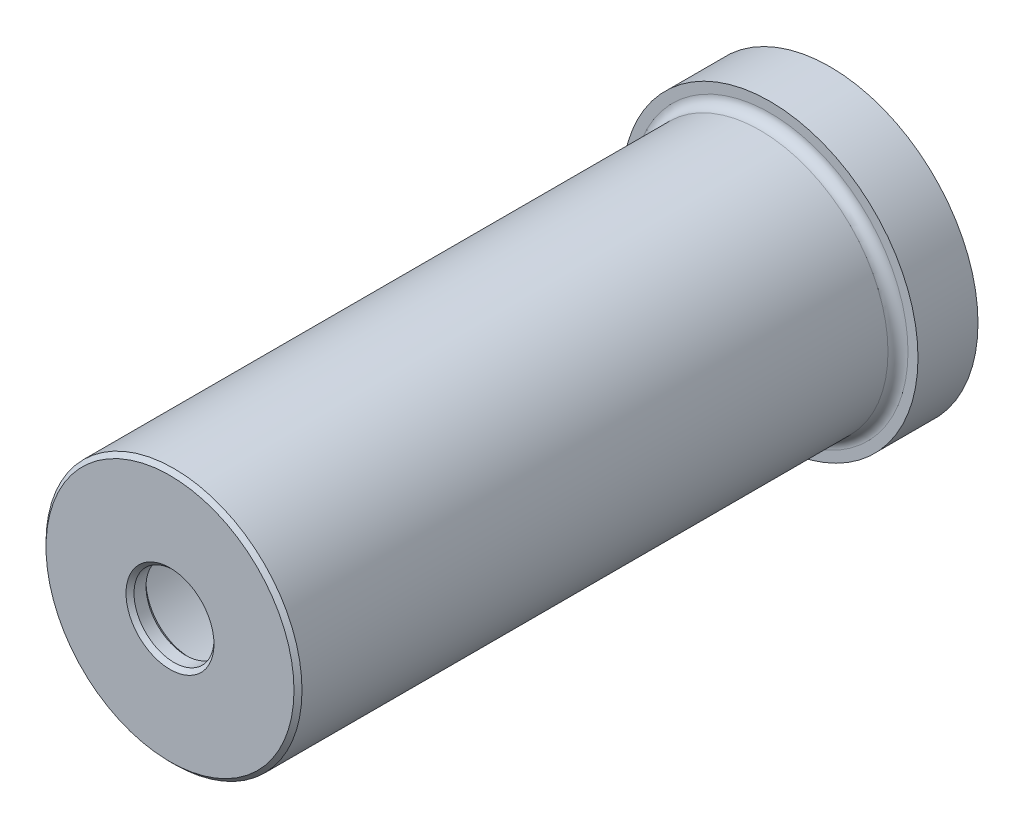
ISO-10303-21;
HEADER;
FILE_DESCRIPTION(('STEP AP214'),'2;1');
FILE_NAME('part.step','',(''),(''),'','','');
FILE_SCHEMA(('AUTOMOTIVE_DESIGN { 1 0 10303 214 1 1 1 1 }'));
ENDSEC;
DATA;
#1=APPLICATION_CONTEXT('core data for automotive mechanical design processes');
#2=APPLICATION_PROTOCOL_DEFINITION('international standard','automotive_design',2000,#1);
#3=PRODUCT_CONTEXT('',#1,'mechanical');
#4=PRODUCT('Part','Part','',(#3));
#5=PRODUCT_RELATED_PRODUCT_CATEGORY('part','',(#4));
#6=PRODUCT_DEFINITION_FORMATION('','',#4);
#7=PRODUCT_DEFINITION_CONTEXT('part definition',#1,'design');
#8=PRODUCT_DEFINITION('design','',#6,#7);
#9=PRODUCT_DEFINITION_SHAPE('','',#8);
#10=(LENGTH_UNIT() NAMED_UNIT(*) SI_UNIT(.MILLI.,.METRE.));
#11=(NAMED_UNIT(*) PLANE_ANGLE_UNIT() SI_UNIT($,.RADIAN.));
#12=(NAMED_UNIT(*) SI_UNIT($,.STERADIAN.) SOLID_ANGLE_UNIT());
#13=UNCERTAINTY_MEASURE_WITH_UNIT(LENGTH_MEASURE(1.E-05),#10,'distance_accuracy_value','');
#14=(GEOMETRIC_REPRESENTATION_CONTEXT(3) GLOBAL_UNCERTAINTY_ASSIGNED_CONTEXT((#13)) GLOBAL_UNIT_ASSIGNED_CONTEXT((#10,
#11,#12)) REPRESENTATION_CONTEXT('',''));
#15=CARTESIAN_POINT('',(0.,0.,0.));
#16=DIRECTION('',(0.,0.,1.));
#17=DIRECTION('',(1.,0.,0.));
#18=AXIS2_PLACEMENT_3D('',#15,#16,#17);
#19=CARTESIAN_POINT('',(0.,0.,30.));
#20=DIRECTION('',(0.,0.,-1.));
#21=DIRECTION('',(-1.,0.,0.));
#22=AXIS2_PLACEMENT_3D('',#19,#20,#21);
#23=CYLINDRICAL_SURFACE('',#22,74.);
#24=CARTESIAN_POINT('',(0.,0.,30.));
#25=DIRECTION('',(0.,0.,1.));
#26=DIRECTION('',(1.,0.,0.));
#27=AXIS2_PLACEMENT_3D('',#24,#25,#26);
#28=CIRCLE('',#27,74.);
#29=CARTESIAN_POINT('',(74.,0.,30.));
#30=VERTEX_POINT('',#29);
#31=EDGE_CURVE('E80',#30,#30,#28,.T.);
#32=ORIENTED_EDGE('',*,*,#31,.F.);
#33=EDGE_LOOP('',(#32));
#34=FACE_BOUND('',#33,.T.);
#35=CARTESIAN_POINT('',(0.,0.,0.));
#36=DIRECTION('',(0.,0.,1.));
#37=DIRECTION('',(1.,0.,0.));
#38=AXIS2_PLACEMENT_3D('',#35,#36,#37);
#39=CIRCLE('',#38,74.);
#40=CARTESIAN_POINT('',(74.,0.,0.));
#41=VERTEX_POINT('',#40);
#42=EDGE_CURVE('E81',#41,#41,#39,.T.);
#43=ORIENTED_EDGE('',*,*,#42,.T.);
#44=EDGE_LOOP('',(#43));
#45=FACE_BOUND('',#44,.T.);
#46=ADVANCED_FACE('F38',(#34,#45),#23,.T.);
#47=CARTESIAN_POINT('',(0.,0.,30.));
#48=DIRECTION('',(0.,0.,1.));
#49=DIRECTION('',(1.,0.,0.));
#50=AXIS2_PLACEMENT_3D('',#47,#48,#49);
#51=PLANE('',#50);
#52=CARTESIAN_POINT('',(0.,0.,30.));
#53=DIRECTION('',(0.,0.,1.));
#54=DIRECTION('',(1.,0.,0.));
#55=AXIS2_PLACEMENT_3D('',#52,#53,#54);
#56=CIRCLE('',#55,69.);
#57=CARTESIAN_POINT('',(69.,0.,30.));
#58=VERTEX_POINT('',#57);
#59=EDGE_CURVE('E72',#58,#58,#56,.F.);
#60=ORIENTED_EDGE('',*,*,#59,.T.);
#61=EDGE_LOOP('',(#60));
#62=FACE_BOUND('',#61,.T.);
#63=ORIENTED_EDGE('',*,*,#31,.T.);
#64=EDGE_LOOP('',(#63));
#65=FACE_BOUND('',#64,.T.);
#66=ADVANCED_FACE('F121',(#62,#65),#51,.T.);
#67=CARTESIAN_POINT('',(0.,0.,0.));
#68=DIRECTION('',(0.,0.,1.));
#69=DIRECTION('',(1.,0.,0.));
#70=AXIS2_PLACEMENT_3D('',#67,#68,#69);
#71=PLANE('',#70);
#72=CARTESIAN_POINT('',(0.,0.,0.));
#73=DIRECTION('',(0.,0.,1.));
#74=DIRECTION('',(1.,0.,0.));
#75=AXIS2_PLACEMENT_3D('',#72,#73,#74);
#76=CIRCLE('',#75,64.);
#77=CARTESIAN_POINT('',(64.,0.,0.));
#78=VERTEX_POINT('',#77);
#79=EDGE_CURVE('E89',#78,#78,#76,.T.);
#80=ORIENTED_EDGE('',*,*,#79,.T.);
#81=EDGE_LOOP('',(#80));
#82=FACE_BOUND('',#81,.T.);
#83=ORIENTED_EDGE('',*,*,#42,.F.);
#84=EDGE_LOOP('',(#83));
#85=FACE_BOUND('',#84,.T.);
#86=ADVANCED_FACE('F127',(#82,#85),#71,.F.);
#87=CARTESIAN_POINT('',(0.,0.,330.));
#88=DIRECTION('',(0.,0.,-1.));
#89=DIRECTION('',(-1.,0.,0.));
#90=AXIS2_PLACEMENT_3D('',#87,#88,#89);
#91=CYLINDRICAL_SURFACE('',#90,64.);
#92=CARTESIAN_POINT('',(0.,0.,328.));
#93=DIRECTION('',(0.,0.,1.));
#94=DIRECTION('',(1.,0.,0.));
#95=AXIS2_PLACEMENT_3D('',#92,#93,#94);
#96=CIRCLE('',#95,64.);
#97=CARTESIAN_POINT('',(64.,0.,328.));
#98=VERTEX_POINT('',#97);
#99=EDGE_CURVE('E65',#98,#98,#96,.F.);
#100=ORIENTED_EDGE('',*,*,#99,.T.);
#101=EDGE_LOOP('',(#100));
#102=FACE_BOUND('',#101,.T.);
#103=CARTESIAN_POINT('',(0.,0.,35.));
#104=DIRECTION('',(0.,0.,1.));
#105=DIRECTION('',(1.,0.,0.));
#106=AXIS2_PLACEMENT_3D('',#103,#104,#105);
#107=CIRCLE('',#106,64.);
#108=CARTESIAN_POINT('',(64.,0.,35.));
#109=VERTEX_POINT('',#108);
#110=EDGE_CURVE('E76',#109,#109,#107,.T.);
#111=ORIENTED_EDGE('',*,*,#110,.T.);
#112=EDGE_LOOP('',(#111));
#113=FACE_BOUND('',#112,.T.);
#114=ADVANCED_FACE('F165',(#102,#113),#91,.T.);
#115=CARTESIAN_POINT('',(0.,0.,330.));
#116=DIRECTION('',(0.,0.,1.));
#117=DIRECTION('',(1.,0.,0.));
#118=AXIS2_PLACEMENT_3D('',#115,#116,#117);
#119=PLANE('',#118);
#120=CARTESIAN_POINT('',(0.,0.,330.));
#121=DIRECTION('',(0.,0.,1.));
#122=DIRECTION('',(1.,0.,0.));
#123=AXIS2_PLACEMENT_3D('',#120,#121,#122);
#124=CIRCLE('',#123,22.);
#125=CARTESIAN_POINT('',(22.,0.,330.));
#126=VERTEX_POINT('',#125);
#127=EDGE_CURVE('E10',#126,#126,#124,.F.);
#128=ORIENTED_EDGE('',*,*,#127,.T.);
#129=EDGE_LOOP('',(#128));
#130=FACE_BOUND('',#129,.T.);
#131=CARTESIAN_POINT('',(0.,0.,330.));
#132=DIRECTION('',(0.,0.,1.));
#133=DIRECTION('',(1.,0.,0.));
#134=AXIS2_PLACEMENT_3D('',#131,#132,#133);
#135=CIRCLE('',#134,62.);
#136=CARTESIAN_POINT('',(62.,0.,330.));
#137=VERTEX_POINT('',#136);
#138=EDGE_CURVE('E68',#137,#137,#135,.T.);
#139=ORIENTED_EDGE('',*,*,#138,.T.);
#140=EDGE_LOOP('',(#139));
#141=FACE_BOUND('',#140,.T.);
#142=ADVANCED_FACE('F118',(#130,#141),#119,.T.);
#143=CARTESIAN_POINT('',(0.,0.,30.));
#144=DIRECTION('',(0.,0.,-1.));
#145=DIRECTION('',(-1.,0.,0.));
#146=AXIS2_PLACEMENT_3D('',#143,#144,#145);
#147=CYLINDRICAL_SURFACE('',#146,64.);
#148=CARTESIAN_POINT('',(0.,0.,20.));
#149=DIRECTION('',(0.,0.,1.));
#150=DIRECTION('',(1.,0.,0.));
#151=AXIS2_PLACEMENT_3D('',#148,#149,#150);
#152=CIRCLE('',#151,64.);
#153=CARTESIAN_POINT('',(64.,0.,20.));
#154=VERTEX_POINT('',#153);
#155=EDGE_CURVE('E92',#154,#154,#152,.T.);
#156=ORIENTED_EDGE('',*,*,#155,.T.);
#157=EDGE_LOOP('',(#156));
#158=FACE_BOUND('',#157,.T.);
#159=ORIENTED_EDGE('',*,*,#79,.F.);
#160=EDGE_LOOP('',(#159));
#161=FACE_BOUND('',#160,.T.);
#162=ADVANCED_FACE('F103',(#158,#161),#147,.F.);
#163=CARTESIAN_POINT('',(0.,0.,20.));
#164=DIRECTION('',(0.,0.,1.));
#165=DIRECTION('',(1.,0.,0.));
#166=AXIS2_PLACEMENT_3D('',#163,#164,#165);
#167=PLANE('',#166);
#168=CARTESIAN_POINT('',(0.,0.,20.));
#169=DIRECTION('',(0.,0.,1.));
#170=DIRECTION('',(1.,0.,0.));
#171=AXIS2_PLACEMENT_3D('',#168,#169,#170);
#172=CIRCLE('',#171,54.);
#173=CARTESIAN_POINT('',(54.,0.,20.));
#174=VERTEX_POINT('',#173);
#175=EDGE_CURVE('E85',#174,#174,#172,.T.);
#176=ORIENTED_EDGE('',*,*,#175,.T.);
#177=EDGE_LOOP('',(#176));
#178=FACE_BOUND('',#177,.T.);
#179=ORIENTED_EDGE('',*,*,#155,.F.);
#180=EDGE_LOOP('',(#179));
#181=FACE_BOUND('',#180,.T.);
#182=ADVANCED_FACE('F106',(#178,#181),#167,.F.);
#183=CARTESIAN_POINT('',(0.,0.,330.));
#184=DIRECTION('',(0.,0.,-1.));
#185=DIRECTION('',(-1.,0.,0.));
#186=AXIS2_PLACEMENT_3D('',#183,#184,#185);
#187=CYLINDRICAL_SURFACE('',#186,54.);
#188=CARTESIAN_POINT('',(0.,0.,320.));
#189=DIRECTION('',(0.,0.,1.));
#190=DIRECTION('',(1.,0.,0.));
#191=AXIS2_PLACEMENT_3D('',#188,#189,#190);
#192=CIRCLE('',#191,54.);
#193=CARTESIAN_POINT('',(54.,0.,320.));
#194=VERTEX_POINT('',#193);
#195=EDGE_CURVE('E93',#194,#194,#192,.T.);
#196=ORIENTED_EDGE('',*,*,#195,.T.);
#197=EDGE_LOOP('',(#196));
#198=FACE_BOUND('',#197,.T.);
#199=ORIENTED_EDGE('',*,*,#175,.F.);
#200=EDGE_LOOP('',(#199));
#201=FACE_BOUND('',#200,.T.);
#202=ADVANCED_FACE('F108',(#198,#201),#187,.F.);
#203=CARTESIAN_POINT('',(0.,0.,320.));
#204=DIRECTION('',(0.,0.,1.));
#205=DIRECTION('',(1.,0.,0.));
#206=AXIS2_PLACEMENT_3D('',#203,#204,#205);
#207=PLANE('',#206);
#208=CARTESIAN_POINT('',(0.,0.,320.));
#209=DIRECTION('',(0.,0.,1.));
#210=DIRECTION('',(1.,0.,0.));
#211=AXIS2_PLACEMENT_3D('',#208,#209,#210);
#212=CIRCLE('',#211,22.);
#213=CARTESIAN_POINT('',(22.,0.,320.));
#214=VERTEX_POINT('',#213);
#215=EDGE_CURVE('E60',#214,#214,#212,.T.);
#216=ORIENTED_EDGE('',*,*,#215,.T.);
#217=EDGE_LOOP('',(#216));
#218=FACE_BOUND('',#217,.T.);
#219=ORIENTED_EDGE('',*,*,#195,.F.);
#220=EDGE_LOOP('',(#219));
#221=FACE_BOUND('',#220,.T.);
#222=ADVANCED_FACE('F115',(#218,#221),#207,.F.);
#223=CARTESIAN_POINT('',(0.,0.,35.));
#224=DIRECTION('',(0.,0.,1.));
#225=DIRECTION('',(1.,0.,0.));
#226=AXIS2_PLACEMENT_3D('',#223,#224,#225);
#227=TOROIDAL_SURFACE('',#226,69.,5.);
#228=ORIENTED_EDGE('',*,*,#59,.F.);
#229=EDGE_LOOP('',(#228));
#230=FACE_BOUND('',#229,.T.);
#231=ORIENTED_EDGE('',*,*,#110,.F.);
#232=EDGE_LOOP('',(#231));
#233=FACE_BOUND('',#232,.T.);
#234=ADVANCED_FACE('F134',(#230,#233),#227,.F.);
#235=CARTESIAN_POINT('',(0.,0.,330.));
#236=DIRECTION('',(0.,0.,-1.));
#237=DIRECTION('',(-1.,0.,0.));
#238=AXIS2_PLACEMENT_3D('',#235,#236,#237);
#239=CONICAL_SURFACE('',#238,62.,0.785398163397448);
#240=ORIENTED_EDGE('',*,*,#99,.F.);
#241=EDGE_LOOP('',(#240));
#242=FACE_BOUND('',#241,.T.);
#243=ORIENTED_EDGE('',*,*,#138,.F.);
#244=EDGE_LOOP('',(#243));
#245=FACE_BOUND('',#244,.T.);
#246=ADVANCED_FACE('F137',(#242,#245),#239,.T.);
#247=CARTESIAN_POINT('',(0.,0.,0.));
#248=DIRECTION('',(0.,0.,1.));
#249=DIRECTION('',(1.,0.,0.));
#250=AXIS2_PLACEMENT_3D('',#247,#248,#249);
#251=CYLINDRICAL_SURFACE('',#250,20.);
#252=CARTESIAN_POINT('',(0.,0.,322.));
#253=DIRECTION('',(0.,0.,1.));
#254=DIRECTION('',(1.,0.,0.));
#255=AXIS2_PLACEMENT_3D('',#252,#253,#254);
#256=CIRCLE('',#255,20.);
#257=CARTESIAN_POINT('',(20.,0.,322.));
#258=VERTEX_POINT('',#257);
#259=EDGE_CURVE('E46',#258,#258,#256,.F.);
#260=ORIENTED_EDGE('',*,*,#259,.T.);
#261=EDGE_LOOP('',(#260));
#262=FACE_BOUND('',#261,.T.);
#263=CARTESIAN_POINT('',(0.,0.,328.));
#264=DIRECTION('',(0.,0.,1.));
#265=DIRECTION('',(1.,0.,0.));
#266=AXIS2_PLACEMENT_3D('',#263,#264,#265);
#267=CIRCLE('',#266,20.);
#268=CARTESIAN_POINT('',(20.,0.,328.));
#269=VERTEX_POINT('',#268);
#270=EDGE_CURVE('E53',#269,#269,#267,.T.);
#271=ORIENTED_EDGE('',*,*,#270,.T.);
#272=EDGE_LOOP('',(#271));
#273=FACE_BOUND('',#272,.T.);
#274=ADVANCED_FACE('F140',(#262,#273),#251,.F.);
#275=CARTESIAN_POINT('',(0.,0.,320.));
#276=DIRECTION('',(0.,0.,-1.));
#277=DIRECTION('',(-1.,0.,0.));
#278=AXIS2_PLACEMENT_3D('',#275,#276,#277);
#279=CONICAL_SURFACE('',#278,22.,0.785398163397439);
#280=ORIENTED_EDGE('',*,*,#259,.F.);
#281=EDGE_LOOP('',(#280));
#282=FACE_BOUND('',#281,.T.);
#283=ORIENTED_EDGE('',*,*,#215,.F.);
#284=EDGE_LOOP('',(#283));
#285=FACE_BOUND('',#284,.T.);
#286=ADVANCED_FACE('F142',(#282,#285),#279,.F.);
#287=CARTESIAN_POINT('',(0.,0.,328.));
#288=DIRECTION('',(0.,0.,1.));
#289=DIRECTION('',(1.,0.,0.));
#290=AXIS2_PLACEMENT_3D('',#287,#288,#289);
#291=CONICAL_SURFACE('',#290,20.,0.785398163397453);
#292=ORIENTED_EDGE('',*,*,#127,.F.);
#293=EDGE_LOOP('',(#292));
#294=FACE_BOUND('',#293,.T.);
#295=ORIENTED_EDGE('',*,*,#270,.F.);
#296=EDGE_LOOP('',(#295));
#297=FACE_BOUND('',#296,.T.);
#298=ADVANCED_FACE('F40',(#294,#297),#291,.F.);
#299=CLOSED_SHELL('',(#46,#66,#86,#114,#142,#162,#182,#202,#222,#234,#246,#274,#286,#298));
#300=MANIFOLD_SOLID_BREP('B2',#299);
#301=ADVANCED_BREP_SHAPE_REPRESENTATION('',(#18,#300),#14);
#302=SHAPE_DEFINITION_REPRESENTATION(#9,#301);
ENDSEC;
END-ISO-10303-21;
